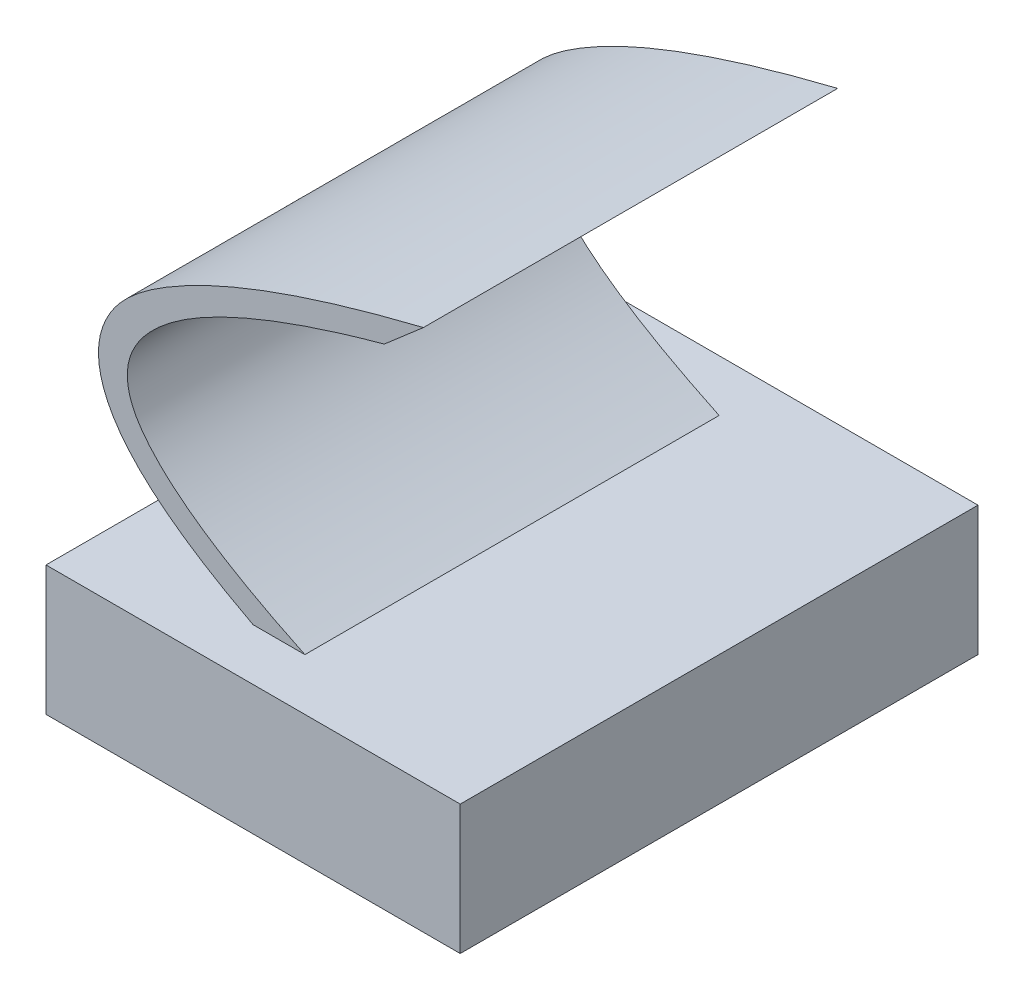
ISO-10303-21;
HEADER;
FILE_DESCRIPTION(('STEP AP214'),'2;1');
FILE_NAME('part.step','',(''),(''),'','','');
FILE_SCHEMA(('AUTOMOTIVE_DESIGN { 1 0 10303 214 1 1 1 1 }'));
ENDSEC;
DATA;
#1=APPLICATION_CONTEXT('core data for automotive mechanical design processes');
#2=APPLICATION_PROTOCOL_DEFINITION('international standard','automotive_design',2000,#1);
#3=PRODUCT_CONTEXT('',#1,'mechanical');
#4=PRODUCT('Part','Part','',(#3));
#5=PRODUCT_RELATED_PRODUCT_CATEGORY('part','',(#4));
#6=PRODUCT_DEFINITION_FORMATION('','',#4);
#7=PRODUCT_DEFINITION_CONTEXT('part definition',#1,'design');
#8=PRODUCT_DEFINITION('design','',#6,#7);
#9=PRODUCT_DEFINITION_SHAPE('','',#8);
#10=(LENGTH_UNIT() NAMED_UNIT(*) SI_UNIT(.MILLI.,.METRE.));
#11=(NAMED_UNIT(*) PLANE_ANGLE_UNIT() SI_UNIT($,.RADIAN.));
#12=(NAMED_UNIT(*) SI_UNIT($,.STERADIAN.) SOLID_ANGLE_UNIT());
#13=UNCERTAINTY_MEASURE_WITH_UNIT(LENGTH_MEASURE(1.E-05),#10,'distance_accuracy_value','');
#14=(GEOMETRIC_REPRESENTATION_CONTEXT(3) GLOBAL_UNCERTAINTY_ASSIGNED_CONTEXT((#13)) GLOBAL_UNIT_ASSIGNED_CONTEXT((#10,
#11,#12)) REPRESENTATION_CONTEXT('',''));
#15=CARTESIAN_POINT('',(0.,0.,0.));
#16=DIRECTION('',(0.,0.,1.));
#17=DIRECTION('',(1.,0.,0.));
#18=AXIS2_PLACEMENT_3D('',#15,#16,#17);
#19=CARTESIAN_POINT('',(-6.03225573784845,2.5,-6.90133061882157));
#20=DIRECTION('',(1.,0.,0.));
#21=DIRECTION('',(0.,0.,-1.));
#22=AXIS2_PLACEMENT_3D('',#19,#20,#21);
#23=PLANE('',#22);
#24=DIRECTION('',(0.,0.,1.));
#25=VECTOR('',#24,1.);
#26=CARTESIAN_POINT('',(-6.03225573784845,0.,-6.90133061882157));
#27=LINE('',#26,#25);
#28=CARTESIAN_POINT('',(-6.03225573784845,0.,-6.90133061882157));
#29=VERTEX_POINT('',#28);
#30=CARTESIAN_POINT('',(-6.03225573784845,0.,3.09866938117843));
#31=VERTEX_POINT('',#30);
#32=EDGE_CURVE('E117',#29,#31,#27,.T.);
#33=ORIENTED_EDGE('',*,*,#32,.T.);
#34=DIRECTION('',(0.,-1.,0.));
#35=VECTOR('',#34,1.);
#36=CARTESIAN_POINT('',(-6.03225573784845,2.5,3.09866938117843));
#37=LINE('',#36,#35);
#38=CARTESIAN_POINT('',(-6.03225573784845,2.5,3.09866938117843));
#39=VERTEX_POINT('',#38);
#40=EDGE_CURVE('E11',#39,#31,#37,.T.);
#41=ORIENTED_EDGE('',*,*,#40,.F.);
#42=DIRECTION('',(0.,0.,1.));
#43=VECTOR('',#42,1.);
#44=CARTESIAN_POINT('',(-6.03225573784845,2.5,-6.90133061882157));
#45=LINE('',#44,#43);
#46=CARTESIAN_POINT('',(-6.03225573784845,2.5,-6.90133061882157));
#47=VERTEX_POINT('',#46);
#48=EDGE_CURVE('E187',#47,#39,#45,.T.);
#49=ORIENTED_EDGE('',*,*,#48,.F.);
#50=DIRECTION('',(0.,-1.,0.));
#51=VECTOR('',#50,1.);
#52=CARTESIAN_POINT('',(-6.03225573784845,2.5,-6.90133061882157));
#53=LINE('',#52,#51);
#54=EDGE_CURVE('E181',#47,#29,#53,.T.);
#55=ORIENTED_EDGE('',*,*,#54,.T.);
#56=EDGE_LOOP('',(#33,#41,#49,#55));
#57=FACE_BOUND('',#56,.T.);
#58=ADVANCED_FACE('F33',(#57),#23,.F.);
#59=CARTESIAN_POINT('',(-6.03225573784845,2.5,3.09866938117843));
#60=DIRECTION('',(0.,0.,-1.));
#61=DIRECTION('',(-1.,0.,0.));
#62=AXIS2_PLACEMENT_3D('',#59,#60,#61);
#63=PLANE('',#62);
#64=DIRECTION('',(1.,0.,0.));
#65=VECTOR('',#64,1.);
#66=CARTESIAN_POINT('',(-6.03225573784845,0.,3.09866938117843));
#67=LINE('',#66,#65);
#68=CARTESIAN_POINT('',(1.96774426215155,0.,3.09866938117843));
#69=VERTEX_POINT('',#68);
#70=EDGE_CURVE('E190',#31,#69,#67,.T.);
#71=ORIENTED_EDGE('',*,*,#70,.T.);
#72=DIRECTION('',(0.,-1.,0.));
#73=VECTOR('',#72,1.);
#74=CARTESIAN_POINT('',(1.96774426215155,2.5,3.09866938117843));
#75=LINE('',#74,#73);
#76=CARTESIAN_POINT('',(1.96774426215155,2.5,3.09866938117843));
#77=VERTEX_POINT('',#76);
#78=EDGE_CURVE('E42',#77,#69,#75,.T.);
#79=ORIENTED_EDGE('',*,*,#78,.F.);
#80=DIRECTION('',(1.,0.,0.));
#81=VECTOR('',#80,1.);
#82=CARTESIAN_POINT('',(-6.03225573784845,2.5,3.09866938117843));
#83=LINE('',#82,#81);
#84=EDGE_CURVE('E197',#39,#77,#83,.T.);
#85=ORIENTED_EDGE('',*,*,#84,.F.);
#86=ORIENTED_EDGE('',*,*,#40,.T.);
#87=EDGE_LOOP('',(#71,#79,#85,#86));
#88=FACE_BOUND('',#87,.T.);
#89=ADVANCED_FACE('F262',(#88),#63,.F.);
#90=CARTESIAN_POINT('',(1.96774426215155,2.5,-6.90133061882157));
#91=DIRECTION('',(-1.,0.,0.));
#92=DIRECTION('',(0.,0.,1.));
#93=AXIS2_PLACEMENT_3D('',#90,#91,#92);
#94=PLANE('',#93);
#95=DIRECTION('',(0.,0.,-1.));
#96=VECTOR('',#95,1.);
#97=CARTESIAN_POINT('',(1.96774426215155,0.,-6.90133061882157));
#98=LINE('',#97,#96);
#99=CARTESIAN_POINT('',(1.96774426215155,0.,-6.90133061882157));
#100=VERTEX_POINT('',#99);
#101=EDGE_CURVE('E188',#69,#100,#98,.T.);
#102=ORIENTED_EDGE('',*,*,#101,.T.);
#103=DIRECTION('',(0.,-1.,0.));
#104=VECTOR('',#103,1.);
#105=CARTESIAN_POINT('',(1.96774426215155,2.5,-6.90133061882157));
#106=LINE('',#105,#104);
#107=CARTESIAN_POINT('',(1.96774426215155,2.5,-6.90133061882157));
#108=VERTEX_POINT('',#107);
#109=EDGE_CURVE('E178',#108,#100,#106,.T.);
#110=ORIENTED_EDGE('',*,*,#109,.F.);
#111=DIRECTION('',(0.,0.,-1.));
#112=VECTOR('',#111,1.);
#113=CARTESIAN_POINT('',(1.96774426215155,2.5,-6.90133061882157));
#114=LINE('',#113,#112);
#115=EDGE_CURVE('E195',#77,#108,#114,.T.);
#116=ORIENTED_EDGE('',*,*,#115,.F.);
#117=ORIENTED_EDGE('',*,*,#78,.T.);
#118=EDGE_LOOP('',(#102,#110,#116,#117));
#119=FACE_BOUND('',#118,.T.);
#120=ADVANCED_FACE('F267',(#119),#94,.F.);
#121=CARTESIAN_POINT('',(-6.03225573784845,2.5,-6.90133061882157));
#122=DIRECTION('',(0.,0.,1.));
#123=DIRECTION('',(1.,0.,0.));
#124=AXIS2_PLACEMENT_3D('',#121,#122,#123);
#125=PLANE('',#124);
#126=DIRECTION('',(-1.,0.,0.));
#127=VECTOR('',#126,1.);
#128=CARTESIAN_POINT('',(-6.03225573784845,0.,-6.90133061882157));
#129=LINE('',#128,#127);
#130=EDGE_CURVE('E185',#100,#29,#129,.T.);
#131=ORIENTED_EDGE('',*,*,#130,.T.);
#132=ORIENTED_EDGE('',*,*,#54,.F.);
#133=DIRECTION('',(-1.,0.,0.));
#134=VECTOR('',#133,1.);
#135=CARTESIAN_POINT('',(-6.03225573784845,2.5,-6.90133061882157));
#136=LINE('',#135,#134);
#137=EDGE_CURVE('E184',#108,#47,#136,.T.);
#138=ORIENTED_EDGE('',*,*,#137,.F.);
#139=ORIENTED_EDGE('',*,*,#109,.T.);
#140=EDGE_LOOP('',(#131,#132,#138,#139));
#141=FACE_BOUND('',#140,.T.);
#142=ADVANCED_FACE('F283',(#141),#125,.F.);
#143=CARTESIAN_POINT('',(0.,2.5,0.));
#144=DIRECTION('',(0.,1.,0.));
#145=DIRECTION('',(0.,0.,1.));
#146=AXIS2_PLACEMENT_3D('',#143,#144,#145);
#147=PLANE('',#146);
#148=DIRECTION('',(0.,0.,1.));
#149=VECTOR('',#148,1.);
#150=CARTESIAN_POINT('',(-3.03225573784845,2.5,-5.90133061882157));
#151=LINE('',#150,#149);
#152=CARTESIAN_POINT('',(-3.03225573784845,2.5,-5.90133061882157));
#153=VERTEX_POINT('',#152);
#154=CARTESIAN_POINT('',(-3.03225573784845,2.5,2.09866938117843));
#155=VERTEX_POINT('',#154);
#156=EDGE_CURVE('E203',#153,#155,#151,.T.);
#157=ORIENTED_EDGE('',*,*,#156,.F.);
#158=DIRECTION('',(-1.,0.,0.));
#159=VECTOR('',#158,1.);
#160=CARTESIAN_POINT('',(-3.03225573784845,2.5,-5.90133061882157));
#161=LINE('',#160,#159);
#162=CARTESIAN_POINT('',(-2.03225573784845,2.5,-5.90133061882157));
#163=VERTEX_POINT('',#162);
#164=EDGE_CURVE('E55',#163,#153,#161,.T.);
#165=ORIENTED_EDGE('',*,*,#164,.F.);
#166=DIRECTION('',(0.,0.,-1.));
#167=VECTOR('',#166,1.);
#168=CARTESIAN_POINT('',(-2.03225573784845,2.5,-5.90133061882157));
#169=LINE('',#168,#167);
#170=CARTESIAN_POINT('',(-2.03225573784845,2.5,2.09866938117843));
#171=VERTEX_POINT('',#170);
#172=EDGE_CURVE('E121',#171,#163,#169,.T.);
#173=ORIENTED_EDGE('',*,*,#172,.F.);
#174=DIRECTION('',(1.,0.,0.));
#175=VECTOR('',#174,1.);
#176=CARTESIAN_POINT('',(-3.03225573784845,2.5,2.09866938117843));
#177=LINE('',#176,#175);
#178=EDGE_CURVE('E50',#155,#171,#177,.T.);
#179=ORIENTED_EDGE('',*,*,#178,.F.);
#180=EDGE_LOOP('',(#157,#165,#173,#179));
#181=FACE_BOUND('',#180,.T.);
#182=ORIENTED_EDGE('',*,*,#48,.T.);
#183=ORIENTED_EDGE('',*,*,#84,.T.);
#184=ORIENTED_EDGE('',*,*,#115,.T.);
#185=ORIENTED_EDGE('',*,*,#137,.T.);
#186=EDGE_LOOP('',(#182,#183,#184,#185));
#187=FACE_BOUND('',#186,.T.);
#188=ADVANCED_FACE('F279',(#181,#187),#147,.T.);
#189=CARTESIAN_POINT('',(0.,0.,0.));
#190=DIRECTION('',(0.,1.,0.));
#191=DIRECTION('',(0.,0.,1.));
#192=AXIS2_PLACEMENT_3D('',#189,#190,#191);
#193=PLANE('',#192);
#194=ORIENTED_EDGE('',*,*,#32,.F.);
#195=ORIENTED_EDGE('',*,*,#130,.F.);
#196=ORIENTED_EDGE('',*,*,#101,.F.);
#197=ORIENTED_EDGE('',*,*,#70,.F.);
#198=EDGE_LOOP('',(#194,#195,#196,#197));
#199=FACE_BOUND('',#198,.T.);
#200=ADVANCED_FACE('F155',(#199),#193,.F.);
#201=CARTESIAN_POINT('',(-2.03523150282254,7.13120536125455,0.));
#202=DIRECTION('',(0.654408197749757,-0.756141462107399,0.));
#203=DIRECTION('',(0.,0.,1.));
#204=AXIS2_PLACEMENT_3D('',#201,#202,#203);
#205=PLANE('',#204);
#206=DIRECTION('',(0.,0.,1.));
#207=VECTOR('',#206,1.);
#208=CARTESIAN_POINT('',(0.257582784277738,9.11553837377631,-5.90133061882157));
#209=LINE('',#208,#207);
#210=CARTESIAN_POINT('',(0.257582784277738,9.11553837377631,-5.90133061882157));
#211=VERTEX_POINT('',#210);
#212=CARTESIAN_POINT('',(0.257582784277737,9.11553837377631,2.09866938117843));
#213=VERTEX_POINT('',#212);
#214=EDGE_CURVE('E122',#211,#213,#209,.T.);
#215=ORIENTED_EDGE('',*,*,#214,.T.);
#216=DIRECTION('',(-0.756141462107399,-0.654408197749757,0.));
#217=VECTOR('',#216,1.);
#218=CARTESIAN_POINT('',(0.257582784277737,9.11553837377631,2.09866938117843));
#219=LINE('',#218,#217);
#220=CARTESIAN_POINT('',(-0.498558677829662,8.46113017602656,2.09866938117843));
#221=VERTEX_POINT('',#220);
#222=EDGE_CURVE('E104',#213,#221,#219,.T.);
#223=ORIENTED_EDGE('',*,*,#222,.T.);
#224=DIRECTION('',(0.,0.,-1.));
#225=VECTOR('',#224,1.);
#226=CARTESIAN_POINT('',(-0.498558677829662,8.46113017602656,-5.90133061882157));
#227=LINE('',#226,#225);
#228=CARTESIAN_POINT('',(-0.498558677829662,8.46113017602656,-5.90133061882157));
#229=VERTEX_POINT('',#228);
#230=EDGE_CURVE('E98',#221,#229,#227,.T.);
#231=ORIENTED_EDGE('',*,*,#230,.T.);
#232=DIRECTION('',(0.756141462107399,0.654408197749757,0.));
#233=VECTOR('',#232,1.);
#234=CARTESIAN_POINT('',(0.257582784277738,9.11553837377631,-5.90133061882157));
#235=LINE('',#234,#233);
#236=EDGE_CURVE('E101',#229,#211,#235,.T.);
#237=ORIENTED_EDGE('',*,*,#236,.T.);
#238=EDGE_LOOP('',(#215,#223,#231,#237));
#239=FACE_BOUND('',#238,.T.);
#240=ADVANCED_FACE('F100',(#239),#205,.T.);
#241=CARTESIAN_POINT('',(-3.03225573784845,2.5,-5.90133061882157));
#242=CARTESIAN_POINT('',(-4.26604007621631,3.14881239417956,-5.90133061882157));
#243=CARTESIAN_POINT('',(-5.16480673483734,3.79647117311019,-5.90133061882157));
#244=CARTESIAN_POINT('',(-5.89226581252216,4.85166730901712,-5.90133061882157));
#245=CARTESIAN_POINT('',(-6.02808041227737,5.22453279642025,-5.90133061882157));
#246=CARTESIAN_POINT('',(-6.00959954573206,5.96825956703094,-5.90133061882157));
#247=CARTESIAN_POINT('',(-5.84244980381291,6.32379246228702,-5.90133061882157));
#248=CARTESIAN_POINT('',(-5.35325513839032,6.88152855094391,-5.90133061882157));
#249=CARTESIAN_POINT('',(-5.05152721637184,7.09813587865281,-5.90133061882157));
#250=CARTESIAN_POINT('',(-4.3634064086436,7.51679699135821,-5.90133061882157));
#251=CARTESIAN_POINT('',(-3.96746715761483,7.71786432245243,-5.90133061882157));
#252=CARTESIAN_POINT('',(-2.55932326709407,8.32422148051066,-5.90133061882157));
#253=CARTESIAN_POINT('',(-1.32512319567249,8.72601662800702,-5.90133061882157));
#254=CARTESIAN_POINT('',(0.257582784277738,9.11553837377631,-5.90133061882157));
#255=CARTESIAN_POINT('',(-3.03225573784845,2.5,2.09866938117843));
#256=CARTESIAN_POINT('',(-4.26604007621651,3.14881239417966,2.09866938117843));
#257=CARTESIAN_POINT('',(-5.164806734837,3.79647117311019,2.09866938117843));
#258=CARTESIAN_POINT('',(-5.89226581252232,4.85166730901712,2.09866938117843));
#259=CARTESIAN_POINT('',(-6.02808041227737,5.22453279642012,2.09866938117843));
#260=CARTESIAN_POINT('',(-6.00959954573206,5.96825956703106,2.09866938117843));
#261=CARTESIAN_POINT('',(-5.84244980381303,6.32379246228702,2.09866938117843));
#262=CARTESIAN_POINT('',(-5.3532551383902,6.88152855094391,2.09866938117843));
#263=CARTESIAN_POINT('',(-5.05152721637169,7.09813587865281,2.09866938117843));
#264=CARTESIAN_POINT('',(-4.36340640864376,7.51679699135821,2.09866938117843));
#265=CARTESIAN_POINT('',(-3.96746715761472,7.71786432245243,2.09866938117843));
#266=CARTESIAN_POINT('',(-2.55932326709428,8.32422148051066,2.09866938117843));
#267=CARTESIAN_POINT('',(-1.3251231956723,8.72601662800689,2.09866938117843));
#268=CARTESIAN_POINT('',(0.257582784277737,9.11553837377631,2.09866938117843));
#269=B_SPLINE_SURFACE_WITH_KNOTS('',1,3,((#241,#242,#243,#244,#245,#246,#247,#248,#249,#250,
#251,#252,#253,#254),(#255,#256,#257,#258,#259,#260,#261,#262,#263,#264,#265,#266,#267,#268)),
.UNSPECIFIED.,.F.,.F.,.F.,(2,2),(4,2,2,2,2,2,4),(0.,1.),(0.,0.25,0.375,0.5,0.625,0.75,1.),.UNSPECIFIED.);
#270=CARTESIAN_POINT('',(-3.03225573784845,2.5,2.09866938117843));
#271=CARTESIAN_POINT('',(-4.26604007621651,3.14881239417966,2.09866938117843));
#272=CARTESIAN_POINT('',(-5.164806734837,3.79647117311019,2.09866938117843));
#273=CARTESIAN_POINT('',(-5.89226581252232,4.85166730901712,2.09866938117843));
#274=CARTESIAN_POINT('',(-6.02808041227737,5.22453279642012,2.09866938117843));
#275=CARTESIAN_POINT('',(-6.00959954573206,5.96825956703106,2.09866938117843));
#276=CARTESIAN_POINT('',(-5.84244980381303,6.32379246228702,2.09866938117843));
#277=CARTESIAN_POINT('',(-5.3532551383902,6.88152855094391,2.09866938117843));
#278=CARTESIAN_POINT('',(-5.05152721637169,7.09813587865281,2.09866938117843));
#279=CARTESIAN_POINT('',(-4.36340640864376,7.51679699135821,2.09866938117843));
#280=CARTESIAN_POINT('',(-3.96746715761472,7.71786432245243,2.09866938117843));
#281=CARTESIAN_POINT('',(-2.55932326709428,8.32422148051066,2.09866938117843));
#282=CARTESIAN_POINT('',(-1.3251231956723,8.72601662800689,2.09866938117843));
#283=CARTESIAN_POINT('',(0.257582784277737,9.11553837377631,2.09866938117843));
#284=B_SPLINE_CURVE_WITH_KNOTS('',3,(#270,#271,#272,#273,#274,#275,#276,#277,#278,#279,#280,
#281,#282,#283),.UNSPECIFIED.,.F.,.F.,(4,2,2,2,2,2,4),(0.,0.25,0.375,0.5,0.625,0.75,1.),.UNSPECIFIED.);
#285=EDGE_CURVE('E174',#155,#213,#284,.T.);
#286=CARTESIAN_POINT('',(-3.03225573784845,2.5,-5.90133061882157));
#287=CARTESIAN_POINT('',(-4.26604007621631,3.14881239417956,-5.90133061882157));
#288=CARTESIAN_POINT('',(-5.16480673483734,3.79647117311019,-5.90133061882157));
#289=CARTESIAN_POINT('',(-5.89226581252216,4.85166730901712,-5.90133061882157));
#290=CARTESIAN_POINT('',(-6.02808041227737,5.22453279642025,-5.90133061882157));
#291=CARTESIAN_POINT('',(-6.00959954573206,5.96825956703094,-5.90133061882157));
#292=CARTESIAN_POINT('',(-5.84244980381291,6.32379246228702,-5.90133061882157));
#293=CARTESIAN_POINT('',(-5.35325513839032,6.88152855094391,-5.90133061882157));
#294=CARTESIAN_POINT('',(-5.05152721637184,7.09813587865281,-5.90133061882157));
#295=CARTESIAN_POINT('',(-4.3634064086436,7.51679699135821,-5.90133061882157));
#296=CARTESIAN_POINT('',(-3.96746715761483,7.71786432245243,-5.90133061882157));
#297=CARTESIAN_POINT('',(-2.55932326709407,8.32422148051066,-5.90133061882157));
#298=CARTESIAN_POINT('',(-1.32512319567249,8.72601662800702,-5.90133061882157));
#299=CARTESIAN_POINT('',(0.257582784277738,9.11553837377631,-5.90133061882157));
#300=B_SPLINE_CURVE_WITH_KNOTS('',3,(#286,#287,#288,#289,#290,#291,#292,#293,#294,#295,#296,
#297,#298,#299),.UNSPECIFIED.,.F.,.F.,(4,2,2,2,2,2,4),(0.,0.25,0.375,0.5,0.625,0.75,1.),.UNSPECIFIED.);
#301=EDGE_CURVE('E116',#153,#211,#300,.T.);
#302=ORIENTED_EDGE('',*,*,#285,.T.);
#303=ORIENTED_EDGE('',*,*,#214,.F.);
#304=ORIENTED_EDGE('',*,*,#301,.F.);
#305=ORIENTED_EDGE('',*,*,#156,.T.);
#306=EDGE_LOOP('',(#302,#303,#304,#305));
#307=FACE_BOUND('',#306,.T.);
#308=ADVANCED_FACE('F248',(#307),#269,.T.);
#309=CARTESIAN_POINT('',(-3.03225573784845,2.5,2.09866938117843));
#310=DIRECTION('',(0.,0.,1.));
#311=DIRECTION('',(1.,0.,0.));
#312=AXIS2_PLACEMENT_3D('',#309,#310,#311);
#313=PLANE('',#312);
#314=CARTESIAN_POINT('',(-2.03225573784845,2.5,2.09866938117843));
#315=CARTESIAN_POINT('',(-3.27065951769441,3.08731110572216,2.09866938117843));
#316=CARTESIAN_POINT('',(-4.15581202403668,3.6456083814755,2.09866938117843));
#317=CARTESIAN_POINT('',(-5.26349580080173,4.67260543647319,2.09866938117843));
#318=CARTESIAN_POINT('',(-5.51878170100379,5.11861790991509,2.09866938117843));
#319=CARTESIAN_POINT('',(-5.38189458176601,6.10858326616923,2.09866938117843));
#320=CARTESIAN_POINT('',(-4.91825632296915,6.63006436423137,2.09866938117843));
#321=CARTESIAN_POINT('',(-3.24715555571119,7.58728799718062,2.09866938117843));
#322=CARTESIAN_POINT('',(-2.04756532024051,8.03721827851961,2.09866938117843));
#323=CARTESIAN_POINT('',(-0.498558677829662,8.46113017602656,2.09866938117843));
#324=B_SPLINE_CURVE_WITH_KNOTS('',3,(#314,#315,#316,#317,#318,#319,#320,#321,#322,#323),
.UNSPECIFIED.,.F.,.F.,(4,2,2,2,4),(0.,0.25,0.5,0.75,1.),.UNSPECIFIED.);
#325=EDGE_CURVE('E123',#171,#221,#324,.T.);
#326=ORIENTED_EDGE('',*,*,#325,.T.);
#327=ORIENTED_EDGE('',*,*,#222,.F.);
#328=ORIENTED_EDGE('',*,*,#285,.F.);
#329=ORIENTED_EDGE('',*,*,#178,.T.);
#330=EDGE_LOOP('',(#326,#327,#328,#329));
#331=FACE_BOUND('',#330,.T.);
#332=ADVANCED_FACE('F143',(#331),#313,.T.);
#333=CARTESIAN_POINT('',(-2.03225573784845,2.5,2.09866938117843));
#334=CARTESIAN_POINT('',(-3.27065951769441,3.08731110572216,2.09866938117843));
#335=CARTESIAN_POINT('',(-4.15581202403668,3.6456083814755,2.09866938117843));
#336=CARTESIAN_POINT('',(-4.98657485661047,4.41585617272377,2.09866938117843));
#337=CARTESIAN_POINT('',(-5.1815418317626,4.65942811447277,2.09866938117843));
#338=CARTESIAN_POINT('',(-5.42876008287408,5.13243886863249,2.09866938117843));
#339=CARTESIAN_POINT('',(-5.48455992119435,5.36610924897863,2.09866938117843));
#340=CARTESIAN_POINT('',(-5.41611636157546,5.8610919271057,2.09866938117843));
#341=CARTESIAN_POINT('',(-5.28626423476588,6.11842780720698,2.09866938117843));
#342=CARTESIAN_POINT('',(-4.82712893065422,6.62243081923263,2.09866938117843));
#343=CARTESIAN_POINT('',(-4.50048113115466,6.86937027246868,2.09866938117843));
#344=CARTESIAN_POINT('',(-3.24715555571119,7.58728799718062,2.09866938117843));
#345=CARTESIAN_POINT('',(-2.04756532024051,8.03721827851961,2.09866938117843));
#346=CARTESIAN_POINT('',(-0.498558677829662,8.46113017602656,2.09866938117843));
#347=CARTESIAN_POINT('',(-2.03225573784845,2.5,-5.90133061882157));
#348=CARTESIAN_POINT('',(-3.27065951769441,3.08731110572216,-5.90133061882157));
#349=CARTESIAN_POINT('',(-4.15581202403668,3.6456083814755,-5.90133061882157));
#350=CARTESIAN_POINT('',(-4.98657485661047,4.41585617272377,-5.90133061882157));
#351=CARTESIAN_POINT('',(-5.18154183176248,4.65942811447277,-5.90133061882157));
#352=CARTESIAN_POINT('',(-5.4287600828742,5.13243886863249,-5.90133061882157));
#353=CARTESIAN_POINT('',(-5.48455992119435,5.36610924897851,-5.90133061882157));
#354=CARTESIAN_POINT('',(-5.41611636157546,5.86109192710581,-5.90133061882157));
#355=CARTESIAN_POINT('',(-5.28626423476588,6.11842780720683,-5.90133061882157));
#356=CARTESIAN_POINT('',(-4.82712893065422,6.62243081923278,-5.90133061882157));
#357=CARTESIAN_POINT('',(-4.50048113115466,6.86937027246868,-5.90133061882157));
#358=CARTESIAN_POINT('',(-3.24715555571119,7.58728799718062,-5.90133061882157));
#359=CARTESIAN_POINT('',(-2.0475653202415,8.03721827852324,-5.90133061882157));
#360=CARTESIAN_POINT('',(-0.498558677829662,8.46113017602656,-5.90133061882157));
#361=B_SPLINE_SURFACE_WITH_KNOTS('',1,3,((#333,#334,#335,#336,#337,#338,#339,#340,#341,#342,
#343,#344,#345,#346),(#347,#348,#349,#350,#351,#352,#353,#354,#355,#356,#357,#358,#359,#360)),
.UNSPECIFIED.,.F.,.F.,.F.,(2,2),(4,2,2,2,2,2,4),(0.,1.),(0.,0.25,0.375,0.5,0.625,0.75,1.),.UNSPECIFIED.);
#362=CARTESIAN_POINT('',(-2.03225573784845,2.5,-5.90133061882157));
#363=CARTESIAN_POINT('',(-3.27065951769441,3.08731110572216,-5.90133061882157));
#364=CARTESIAN_POINT('',(-4.15581202403668,3.6456083814755,-5.90133061882157));
#365=CARTESIAN_POINT('',(-4.98657485661047,4.41585617272377,-5.90133061882157));
#366=CARTESIAN_POINT('',(-5.18154183176248,4.65942811447277,-5.90133061882157));
#367=CARTESIAN_POINT('',(-5.4287600828742,5.13243886863249,-5.90133061882157));
#368=CARTESIAN_POINT('',(-5.48455992119435,5.36610924897851,-5.90133061882157));
#369=CARTESIAN_POINT('',(-5.41611636157546,5.86109192710581,-5.90133061882157));
#370=CARTESIAN_POINT('',(-5.28626423476588,6.11842780720683,-5.90133061882157));
#371=CARTESIAN_POINT('',(-4.82712893065422,6.62243081923278,-5.90133061882157));
#372=CARTESIAN_POINT('',(-4.50048113115466,6.86937027246868,-5.90133061882157));
#373=CARTESIAN_POINT('',(-3.24715555571119,7.58728799718062,-5.90133061882157));
#374=CARTESIAN_POINT('',(-2.0475653202415,8.03721827852324,-5.90133061882157));
#375=CARTESIAN_POINT('',(-0.498558677829662,8.46113017602656,-5.90133061882157));
#376=B_SPLINE_CURVE_WITH_KNOTS('',3,(#362,#363,#364,#365,#366,#367,#368,#369,#370,#371,#372,
#373,#374,#375),.UNSPECIFIED.,.F.,.F.,(4,2,2,2,2,2,4),(0.,0.25,0.375,0.5,0.625,0.75,1.),.UNSPECIFIED.);
#377=EDGE_CURVE('E36',#163,#229,#376,.T.);
#378=ORIENTED_EDGE('',*,*,#377,.T.);
#379=ORIENTED_EDGE('',*,*,#230,.F.);
#380=ORIENTED_EDGE('',*,*,#325,.F.);
#381=ORIENTED_EDGE('',*,*,#172,.T.);
#382=EDGE_LOOP('',(#378,#379,#380,#381));
#383=FACE_BOUND('',#382,.T.);
#384=ADVANCED_FACE('F120',(#383),#361,.T.);
#385=CARTESIAN_POINT('',(-3.03225573784845,2.5,-5.90133061882157));
#386=DIRECTION('',(0.,0.,1.));
#387=DIRECTION('',(1.,0.,0.));
#388=AXIS2_PLACEMENT_3D('',#385,#386,#387);
#389=PLANE('',#388);
#390=ORIENTED_EDGE('',*,*,#236,.F.);
#391=ORIENTED_EDGE('',*,*,#377,.F.);
#392=ORIENTED_EDGE('',*,*,#164,.T.);
#393=ORIENTED_EDGE('',*,*,#301,.T.);
#394=EDGE_LOOP('',(#390,#391,#392,#393));
#395=FACE_BOUND('',#394,.T.);
#396=ADVANCED_FACE('F113',(#395),#389,.F.);
#397=CLOSED_SHELL('',(#58,#89,#120,#142,#188,#200,#240,#308,#332,#384,#396));
#398=MANIFOLD_SOLID_BREP('B2',#397);
#399=ADVANCED_BREP_SHAPE_REPRESENTATION('',(#18,#398),#14);
#400=SHAPE_DEFINITION_REPRESENTATION(#9,#399);
ENDSEC;
END-ISO-10303-21;
